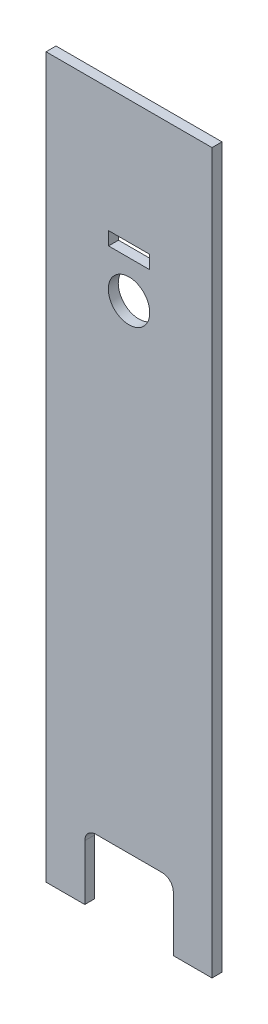
ISO-10303-21;
HEADER;
FILE_DESCRIPTION(('STEP AP214'),'2;1');
FILE_NAME('part.step','',(''),(''),'','','');
FILE_SCHEMA(('AUTOMOTIVE_DESIGN { 1 0 10303 214 1 1 1 1 }'));
ENDSEC;
DATA;
#1=APPLICATION_CONTEXT('core data for automotive mechanical design processes');
#2=APPLICATION_PROTOCOL_DEFINITION('international standard','automotive_design',2000,#1);
#3=PRODUCT_CONTEXT('',#1,'mechanical');
#4=PRODUCT('Part','Part','',(#3));
#5=PRODUCT_RELATED_PRODUCT_CATEGORY('part','',(#4));
#6=PRODUCT_DEFINITION_FORMATION('','',#4);
#7=PRODUCT_DEFINITION_CONTEXT('part definition',#1,'design');
#8=PRODUCT_DEFINITION('design','',#6,#7);
#9=PRODUCT_DEFINITION_SHAPE('','',#8);
#10=(LENGTH_UNIT() NAMED_UNIT(*) SI_UNIT(.MILLI.,.METRE.));
#11=(NAMED_UNIT(*) PLANE_ANGLE_UNIT() SI_UNIT($,.RADIAN.));
#12=(NAMED_UNIT(*) SI_UNIT($,.STERADIAN.) SOLID_ANGLE_UNIT());
#13=UNCERTAINTY_MEASURE_WITH_UNIT(LENGTH_MEASURE(1.E-05),#10,'distance_accuracy_value','');
#14=(GEOMETRIC_REPRESENTATION_CONTEXT(3) GLOBAL_UNCERTAINTY_ASSIGNED_CONTEXT((#13)) GLOBAL_UNIT_ASSIGNED_CONTEXT((#10,
#11,#12)) REPRESENTATION_CONTEXT('',''));
#15=CARTESIAN_POINT('',(0.,0.,0.));
#16=DIRECTION('',(0.,0.,1.));
#17=DIRECTION('',(1.,0.,0.));
#18=AXIS2_PLACEMENT_3D('',#15,#16,#17);
#19=CARTESIAN_POINT('',(-150.,-650.,18.));
#20=DIRECTION('',(0.,1.,0.));
#21=DIRECTION('',(0.,0.,1.));
#22=AXIS2_PLACEMENT_3D('',#19,#20,#21);
#23=PLANE('',#22);
#24=DIRECTION('',(1.,0.,0.));
#25=VECTOR('',#24,1.);
#26=CARTESIAN_POINT('',(-150.,-650.,18.));
#27=LINE('',#26,#25);
#28=CARTESIAN_POINT('',(80.0000000000001,-650.,18.));
#29=VERTEX_POINT('',#28);
#30=CARTESIAN_POINT('',(150.,-650.,18.));
#31=VERTEX_POINT('',#30);
#32=EDGE_CURVE('E239',#29,#31,#27,.T.);
#33=ORIENTED_EDGE('',*,*,#32,.F.);
#34=DIRECTION('',(0.,0.,-1.));
#35=VECTOR('',#34,1.);
#36=CARTESIAN_POINT('',(80.0000000000001,-650.,18.));
#37=LINE('',#36,#35);
#38=CARTESIAN_POINT('',(80.0000000000001,-650.,0.));
#39=VERTEX_POINT('',#38);
#40=EDGE_CURVE('E210',#29,#39,#37,.T.);
#41=ORIENTED_EDGE('',*,*,#40,.T.);
#42=DIRECTION('',(1.,0.,0.));
#43=VECTOR('',#42,1.);
#44=CARTESIAN_POINT('',(-150.,-650.,0.));
#45=LINE('',#44,#43);
#46=CARTESIAN_POINT('',(150.,-650.,0.));
#47=VERTEX_POINT('',#46);
#48=EDGE_CURVE('E251',#39,#47,#45,.T.);
#49=ORIENTED_EDGE('',*,*,#48,.T.);
#50=DIRECTION('',(0.,0.,-1.));
#51=VECTOR('',#50,1.);
#52=CARTESIAN_POINT('',(150.,-650.,18.));
#53=LINE('',#52,#51);
#54=EDGE_CURVE('E58',#31,#47,#53,.T.);
#55=ORIENTED_EDGE('',*,*,#54,.F.);
#56=EDGE_LOOP('',(#33,#41,#49,#55));
#57=FACE_BOUND('',#56,.T.);
#58=ADVANCED_FACE('F50',(#57),#23,.F.);
#59=CARTESIAN_POINT('',(-150.,650.,18.));
#60=DIRECTION('',(1.,0.,0.));
#61=DIRECTION('',(0.,1.,0.));
#62=AXIS2_PLACEMENT_3D('',#59,#60,#61);
#63=PLANE('',#62);
#64=DIRECTION('',(0.,-1.,0.));
#65=VECTOR('',#64,1.);
#66=CARTESIAN_POINT('',(-150.,650.,0.));
#67=LINE('',#66,#65);
#68=CARTESIAN_POINT('',(-150.,650.,0.));
#69=VERTEX_POINT('',#68);
#70=CARTESIAN_POINT('',(-150.,-650.,0.));
#71=VERTEX_POINT('',#70);
#72=EDGE_CURVE('E225',#69,#71,#67,.T.);
#73=ORIENTED_EDGE('',*,*,#72,.T.);
#74=DIRECTION('',(0.,0.,-1.));
#75=VECTOR('',#74,1.);
#76=CARTESIAN_POINT('',(-150.,-650.,18.));
#77=LINE('',#76,#75);
#78=CARTESIAN_POINT('',(-150.,-650.,18.));
#79=VERTEX_POINT('',#78);
#80=EDGE_CURVE('E13',#79,#71,#77,.T.);
#81=ORIENTED_EDGE('',*,*,#80,.F.);
#82=DIRECTION('',(0.,-1.,0.));
#83=VECTOR('',#82,1.);
#84=CARTESIAN_POINT('',(-150.,650.,18.));
#85=LINE('',#84,#83);
#86=CARTESIAN_POINT('',(-150.,650.,18.));
#87=VERTEX_POINT('',#86);
#88=EDGE_CURVE('E236',#87,#79,#85,.T.);
#89=ORIENTED_EDGE('',*,*,#88,.F.);
#90=DIRECTION('',(0.,0.,-1.));
#91=VECTOR('',#90,1.);
#92=CARTESIAN_POINT('',(-150.,650.,18.));
#93=LINE('',#92,#91);
#94=EDGE_CURVE('E248',#87,#69,#93,.T.);
#95=ORIENTED_EDGE('',*,*,#94,.T.);
#96=EDGE_LOOP('',(#73,#81,#89,#95));
#97=FACE_BOUND('',#96,.T.);
#98=ADVANCED_FACE('F52',(#97),#63,.F.);
#99=CARTESIAN_POINT('',(-79.9999999999999,-650.,0.));
#100=VERTEX_POINT('',#99);
#101=EDGE_CURVE('E252',#71,#100,#45,.T.);
#102=ORIENTED_EDGE('',*,*,#101,.T.);
#103=DIRECTION('',(0.,0.,-1.));
#104=VECTOR('',#103,1.);
#105=CARTESIAN_POINT('',(-79.9999999999999,-650.,18.));
#106=LINE('',#105,#104);
#107=CARTESIAN_POINT('',(-79.9999999999999,-650.,18.));
#108=VERTEX_POINT('',#107);
#109=EDGE_CURVE('E232',#108,#100,#106,.T.);
#110=ORIENTED_EDGE('',*,*,#109,.F.);
#111=EDGE_CURVE('E241',#79,#108,#27,.T.);
#112=ORIENTED_EDGE('',*,*,#111,.F.);
#113=ORIENTED_EDGE('',*,*,#80,.T.);
#114=EDGE_LOOP('',(#102,#110,#112,#113));
#115=FACE_BOUND('',#114,.T.);
#116=ADVANCED_FACE('F304',(#115),#23,.F.);
#117=CARTESIAN_POINT('',(150.,650.,18.));
#118=DIRECTION('',(-1.,0.,0.));
#119=DIRECTION('',(0.,-1.,0.));
#120=AXIS2_PLACEMENT_3D('',#117,#118,#119);
#121=PLANE('',#120);
#122=DIRECTION('',(0.,1.,0.));
#123=VECTOR('',#122,1.);
#124=CARTESIAN_POINT('',(150.,650.,0.));
#125=LINE('',#124,#123);
#126=CARTESIAN_POINT('',(150.,650.,0.));
#127=VERTEX_POINT('',#126);
#128=EDGE_CURVE('E255',#47,#127,#125,.T.);
#129=ORIENTED_EDGE('',*,*,#128,.T.);
#130=DIRECTION('',(0.,0.,-1.));
#131=VECTOR('',#130,1.);
#132=CARTESIAN_POINT('',(150.,650.,18.));
#133=LINE('',#132,#131);
#134=CARTESIAN_POINT('',(150.,650.,18.));
#135=VERTEX_POINT('',#134);
#136=EDGE_CURVE('E260',#135,#127,#133,.T.);
#137=ORIENTED_EDGE('',*,*,#136,.F.);
#138=DIRECTION('',(0.,1.,0.));
#139=VECTOR('',#138,1.);
#140=CARTESIAN_POINT('',(150.,650.,18.));
#141=LINE('',#140,#139);
#142=EDGE_CURVE('E244',#31,#135,#141,.T.);
#143=ORIENTED_EDGE('',*,*,#142,.F.);
#144=ORIENTED_EDGE('',*,*,#54,.T.);
#145=EDGE_LOOP('',(#129,#137,#143,#144));
#146=FACE_BOUND('',#145,.T.);
#147=ADVANCED_FACE('F267',(#146),#121,.F.);
#148=CARTESIAN_POINT('',(-150.,650.,18.));
#149=DIRECTION('',(0.,-1.,0.));
#150=DIRECTION('',(0.,0.,-1.));
#151=AXIS2_PLACEMENT_3D('',#148,#149,#150);
#152=PLANE('',#151);
#153=DIRECTION('',(-1.,0.,0.));
#154=VECTOR('',#153,1.);
#155=CARTESIAN_POINT('',(-150.,650.,0.));
#156=LINE('',#155,#154);
#157=EDGE_CURVE('E240',#127,#69,#156,.T.);
#158=ORIENTED_EDGE('',*,*,#157,.T.);
#159=ORIENTED_EDGE('',*,*,#94,.F.);
#160=DIRECTION('',(-1.,0.,0.));
#161=VECTOR('',#160,1.);
#162=CARTESIAN_POINT('',(-150.,650.,18.));
#163=LINE('',#162,#161);
#164=EDGE_CURVE('E246',#135,#87,#163,.T.);
#165=ORIENTED_EDGE('',*,*,#164,.F.);
#166=ORIENTED_EDGE('',*,*,#136,.T.);
#167=EDGE_LOOP('',(#158,#159,#165,#166));
#168=FACE_BOUND('',#167,.T.);
#169=ADVANCED_FACE('F278',(#168),#152,.F.);
#170=CARTESIAN_POINT('',(0.,0.,18.));
#171=DIRECTION('',(0.,0.,1.));
#172=DIRECTION('',(1.,0.,0.));
#173=AXIS2_PLACEMENT_3D('',#170,#171,#172);
#174=PLANE('',#173);
#175=DIRECTION('',(0.,-1.,0.));
#176=VECTOR('',#175,1.);
#177=CARTESIAN_POINT('',(-37.,402.517498316486,18.));
#178=LINE('',#177,#176);
#179=CARTESIAN_POINT('',(-37.,426.517498316486,18.));
#180=VERTEX_POINT('',#179);
#181=CARTESIAN_POINT('',(-37.,402.517498316485,18.));
#182=VERTEX_POINT('',#181);
#183=EDGE_CURVE('E65',#180,#182,#178,.T.);
#184=ORIENTED_EDGE('',*,*,#183,.F.);
#185=DIRECTION('',(-1.,0.,0.));
#186=VECTOR('',#185,1.);
#187=CARTESIAN_POINT('',(-37.,426.517498316486,18.));
#188=LINE('',#187,#186);
#189=CARTESIAN_POINT('',(37.,426.517498316486,18.));
#190=VERTEX_POINT('',#189);
#191=EDGE_CURVE('E169',#190,#180,#188,.T.);
#192=ORIENTED_EDGE('',*,*,#191,.F.);
#193=DIRECTION('',(0.,1.,0.));
#194=VECTOR('',#193,1.);
#195=CARTESIAN_POINT('',(37.,402.482501683514,18.));
#196=LINE('',#195,#194);
#197=CARTESIAN_POINT('',(37.,402.482501683514,18.));
#198=VERTEX_POINT('',#197);
#199=EDGE_CURVE('E172',#198,#190,#196,.T.);
#200=ORIENTED_EDGE('',*,*,#199,.F.);
#201=DIRECTION('',(0.999999888169822,-0.000472927419696015,0.));
#202=VECTOR('',#201,1.);
#203=CARTESIAN_POINT('',(-37.,402.517498316486,18.));
#204=LINE('',#203,#202);
#205=EDGE_CURVE('E178',#182,#198,#204,.T.);
#206=ORIENTED_EDGE('',*,*,#205,.F.);
#207=EDGE_LOOP('',(#184,#192,#200,#206));
#208=FACE_BOUND('',#207,.T.);
#209=CARTESIAN_POINT('',(0.,335.,18.));
#210=DIRECTION('',(0.,0.,-1.));
#211=DIRECTION('',(-1.,0.,0.));
#212=AXIS2_PLACEMENT_3D('',#209,#210,#211);
#213=CIRCLE('',#212,37.5);
#214=CARTESIAN_POINT('',(-37.5,335.,18.));
#215=VERTEX_POINT('',#214);
#216=EDGE_CURVE('E188',#215,#215,#213,.T.);
#217=ORIENTED_EDGE('',*,*,#216,.T.);
#218=EDGE_LOOP('',(#217));
#219=FACE_BOUND('',#218,.T.);
#220=DIRECTION('',(0.,-1.,0.));
#221=VECTOR('',#220,1.);
#222=CARTESIAN_POINT('',(80.0000000000001,-650.,18.));
#223=LINE('',#222,#221);
#224=CARTESIAN_POINT('',(80.0000000000001,-550.,18.));
#225=VERTEX_POINT('',#224);
#226=EDGE_CURVE('E194',#225,#29,#223,.T.);
#227=ORIENTED_EDGE('',*,*,#226,.T.);
#228=ORIENTED_EDGE('',*,*,#32,.T.);
#229=ORIENTED_EDGE('',*,*,#142,.T.);
#230=ORIENTED_EDGE('',*,*,#164,.T.);
#231=ORIENTED_EDGE('',*,*,#88,.T.);
#232=ORIENTED_EDGE('',*,*,#111,.T.);
#233=DIRECTION('',(0.,1.,0.));
#234=VECTOR('',#233,1.);
#235=CARTESIAN_POINT('',(-79.9999999999999,-650.,18.));
#236=LINE('',#235,#234);
#237=CARTESIAN_POINT('',(-79.9999999999999,-550.,18.));
#238=VERTEX_POINT('',#237);
#239=EDGE_CURVE('E197',#108,#238,#236,.T.);
#240=ORIENTED_EDGE('',*,*,#239,.T.);
#241=CARTESIAN_POINT('',(-59.9999999999999,-550.,18.));
#242=DIRECTION('',(0.,0.,-1.));
#243=DIRECTION('',(1.,0.,0.));
#244=AXIS2_PLACEMENT_3D('',#241,#242,#243);
#245=CIRCLE('',#244,20.);
#246=CARTESIAN_POINT('',(-59.9999999999998,-530.,18.));
#247=VERTEX_POINT('',#246);
#248=EDGE_CURVE('E201',#238,#247,#245,.T.);
#249=ORIENTED_EDGE('',*,*,#248,.T.);
#250=DIRECTION('',(1.,0.,0.));
#251=VECTOR('',#250,1.);
#252=CARTESIAN_POINT('',(59.9999999999999,-530.,18.));
#253=LINE('',#252,#251);
#254=CARTESIAN_POINT('',(59.9999999999999,-530.,18.));
#255=VERTEX_POINT('',#254);
#256=EDGE_CURVE('E204',#247,#255,#253,.T.);
#257=ORIENTED_EDGE('',*,*,#256,.T.);
#258=CARTESIAN_POINT('',(60.0000000000001,-550.,18.));
#259=DIRECTION('',(0.,0.,-1.));
#260=DIRECTION('',(-1.,0.,0.));
#261=AXIS2_PLACEMENT_3D('',#258,#259,#260);
#262=CIRCLE('',#261,20.);
#263=EDGE_CURVE('E207',#255,#225,#262,.T.);
#264=ORIENTED_EDGE('',*,*,#263,.T.);
#265=EDGE_LOOP('',(#227,#228,#229,#230,#231,#232,#240,#249,#257,#264));
#266=FACE_BOUND('',#265,.T.);
#267=ADVANCED_FACE('F284',(#208,#219,#266),#174,.T.);
#268=CARTESIAN_POINT('',(0.,0.,0.));
#269=DIRECTION('',(0.,0.,1.));
#270=DIRECTION('',(1.,0.,0.));
#271=AXIS2_PLACEMENT_3D('',#268,#269,#270);
#272=PLANE('',#271);
#273=DIRECTION('',(-1.,0.,0.));
#274=VECTOR('',#273,1.);
#275=CARTESIAN_POINT('',(-37.,426.517498316486,0.));
#276=LINE('',#275,#274);
#277=CARTESIAN_POINT('',(37.,426.517498316486,0.));
#278=VERTEX_POINT('',#277);
#279=CARTESIAN_POINT('',(-37.,426.517498316486,0.));
#280=VERTEX_POINT('',#279);
#281=EDGE_CURVE('E159',#278,#280,#276,.T.);
#282=ORIENTED_EDGE('',*,*,#281,.T.);
#283=DIRECTION('',(0.,-1.,0.));
#284=VECTOR('',#283,1.);
#285=CARTESIAN_POINT('',(-37.,402.517498316486,0.));
#286=LINE('',#285,#284);
#287=CARTESIAN_POINT('',(-37.,402.517498316486,0.));
#288=VERTEX_POINT('',#287);
#289=EDGE_CURVE('E153',#280,#288,#286,.T.);
#290=ORIENTED_EDGE('',*,*,#289,.T.);
#291=DIRECTION('',(0.999999888169822,-0.000472927419696015,0.));
#292=VECTOR('',#291,1.);
#293=CARTESIAN_POINT('',(-37.,402.517498316486,0.));
#294=LINE('',#293,#292);
#295=CARTESIAN_POINT('',(37.,402.482501683514,0.));
#296=VERTEX_POINT('',#295);
#297=EDGE_CURVE('E162',#288,#296,#294,.T.);
#298=ORIENTED_EDGE('',*,*,#297,.T.);
#299=DIRECTION('',(0.,1.,0.));
#300=VECTOR('',#299,1.);
#301=CARTESIAN_POINT('',(37.,402.482501683514,0.));
#302=LINE('',#301,#300);
#303=EDGE_CURVE('E73',#296,#278,#302,.T.);
#304=ORIENTED_EDGE('',*,*,#303,.T.);
#305=EDGE_LOOP('',(#282,#290,#298,#304));
#306=FACE_BOUND('',#305,.T.);
#307=CARTESIAN_POINT('',(0.,335.,0.));
#308=DIRECTION('',(0.,0.,-1.));
#309=DIRECTION('',(-1.,0.,0.));
#310=AXIS2_PLACEMENT_3D('',#307,#308,#309);
#311=CIRCLE('',#310,37.5);
#312=CARTESIAN_POINT('',(-37.5,335.,0.));
#313=VERTEX_POINT('',#312);
#314=EDGE_CURVE('E184',#313,#313,#311,.T.);
#315=ORIENTED_EDGE('',*,*,#314,.F.);
#316=EDGE_LOOP('',(#315));
#317=FACE_BOUND('',#316,.T.);
#318=ORIENTED_EDGE('',*,*,#48,.F.);
#319=DIRECTION('',(0.,-1.,0.));
#320=VECTOR('',#319,1.);
#321=CARTESIAN_POINT('',(80.0000000000001,-650.,0.));
#322=LINE('',#321,#320);
#323=CARTESIAN_POINT('',(80.0000000000001,-550.,0.));
#324=VERTEX_POINT('',#323);
#325=EDGE_CURVE('E191',#324,#39,#322,.T.);
#326=ORIENTED_EDGE('',*,*,#325,.F.);
#327=CARTESIAN_POINT('',(60.0000000000001,-550.,0.));
#328=DIRECTION('',(0.,0.,-1.));
#329=DIRECTION('',(-1.,0.,0.));
#330=AXIS2_PLACEMENT_3D('',#327,#328,#329);
#331=CIRCLE('',#330,20.);
#332=CARTESIAN_POINT('',(59.9999999999999,-530.,0.));
#333=VERTEX_POINT('',#332);
#334=EDGE_CURVE('E198',#333,#324,#331,.T.);
#335=ORIENTED_EDGE('',*,*,#334,.F.);
#336=DIRECTION('',(1.,0.,0.));
#337=VECTOR('',#336,1.);
#338=CARTESIAN_POINT('',(59.9999999999999,-530.,0.));
#339=LINE('',#338,#337);
#340=CARTESIAN_POINT('',(-59.9999999999998,-530.,0.));
#341=VERTEX_POINT('',#340);
#342=EDGE_CURVE('E218',#341,#333,#339,.T.);
#343=ORIENTED_EDGE('',*,*,#342,.F.);
#344=CARTESIAN_POINT('',(-59.9999999999999,-550.,0.));
#345=DIRECTION('',(0.,0.,-1.));
#346=DIRECTION('',(1.,0.,0.));
#347=AXIS2_PLACEMENT_3D('',#344,#345,#346);
#348=CIRCLE('',#347,20.);
#349=CARTESIAN_POINT('',(-79.9999999999999,-550.,0.));
#350=VERTEX_POINT('',#349);
#351=EDGE_CURVE('E215',#350,#341,#348,.T.);
#352=ORIENTED_EDGE('',*,*,#351,.F.);
#353=DIRECTION('',(0.,1.,0.));
#354=VECTOR('',#353,1.);
#355=CARTESIAN_POINT('',(-79.9999999999999,-650.,0.));
#356=LINE('',#355,#354);
#357=EDGE_CURVE('E212',#100,#350,#356,.T.);
#358=ORIENTED_EDGE('',*,*,#357,.F.);
#359=ORIENTED_EDGE('',*,*,#101,.F.);
#360=ORIENTED_EDGE('',*,*,#72,.F.);
#361=ORIENTED_EDGE('',*,*,#157,.F.);
#362=ORIENTED_EDGE('',*,*,#128,.F.);
#363=EDGE_LOOP('',(#318,#326,#335,#343,#352,#358,#359,#360,#361,#362));
#364=FACE_BOUND('',#363,.T.);
#365=ADVANCED_FACE('F166',(#306,#317,#364),#272,.F.);
#366=CARTESIAN_POINT('',(80.0000000000001,-650.,18.));
#367=DIRECTION('',(1.,0.,0.));
#368=DIRECTION('',(0.,0.,-1.));
#369=AXIS2_PLACEMENT_3D('',#366,#367,#368);
#370=PLANE('',#369);
#371=ORIENTED_EDGE('',*,*,#325,.T.);
#372=ORIENTED_EDGE('',*,*,#40,.F.);
#373=ORIENTED_EDGE('',*,*,#226,.F.);
#374=DIRECTION('',(0.,0.,-1.));
#375=VECTOR('',#374,1.);
#376=CARTESIAN_POINT('',(80.0000000000001,-550.,18.));
#377=LINE('',#376,#375);
#378=EDGE_CURVE('E223',#225,#324,#377,.T.);
#379=ORIENTED_EDGE('',*,*,#378,.T.);
#380=EDGE_LOOP('',(#371,#372,#373,#379));
#381=FACE_BOUND('',#380,.T.);
#382=ADVANCED_FACE('F287',(#381),#370,.F.);
#383=CARTESIAN_POINT('',(60.0000000000001,-550.,18.));
#384=DIRECTION('',(0.,0.,-1.));
#385=DIRECTION('',(-1.,0.,0.));
#386=AXIS2_PLACEMENT_3D('',#383,#384,#385);
#387=CYLINDRICAL_SURFACE('',#386,20.);
#388=ORIENTED_EDGE('',*,*,#334,.T.);
#389=ORIENTED_EDGE('',*,*,#378,.F.);
#390=ORIENTED_EDGE('',*,*,#263,.F.);
#391=DIRECTION('',(0.,0.,-1.));
#392=VECTOR('',#391,1.);
#393=CARTESIAN_POINT('',(59.9999999999999,-530.,18.));
#394=LINE('',#393,#392);
#395=EDGE_CURVE('E226',#255,#333,#394,.T.);
#396=ORIENTED_EDGE('',*,*,#395,.T.);
#397=EDGE_LOOP('',(#388,#389,#390,#396));
#398=FACE_BOUND('',#397,.T.);
#399=ADVANCED_FACE('F292',(#398),#387,.F.);
#400=CARTESIAN_POINT('',(59.9999999999999,-530.,18.));
#401=DIRECTION('',(0.,1.,0.));
#402=DIRECTION('',(0.,0.,1.));
#403=AXIS2_PLACEMENT_3D('',#400,#401,#402);
#404=PLANE('',#403);
#405=ORIENTED_EDGE('',*,*,#342,.T.);
#406=ORIENTED_EDGE('',*,*,#395,.F.);
#407=ORIENTED_EDGE('',*,*,#256,.F.);
#408=DIRECTION('',(0.,0.,-1.));
#409=VECTOR('',#408,1.);
#410=CARTESIAN_POINT('',(-59.9999999999998,-530.,18.));
#411=LINE('',#410,#409);
#412=EDGE_CURVE('E228',#247,#341,#411,.T.);
#413=ORIENTED_EDGE('',*,*,#412,.T.);
#414=EDGE_LOOP('',(#405,#406,#407,#413));
#415=FACE_BOUND('',#414,.T.);
#416=ADVANCED_FACE('F296',(#415),#404,.F.);
#417=CARTESIAN_POINT('',(-59.9999999999999,-550.,18.));
#418=DIRECTION('',(0.,0.,-1.));
#419=DIRECTION('',(-1.,0.,0.));
#420=AXIS2_PLACEMENT_3D('',#417,#418,#419);
#421=CYLINDRICAL_SURFACE('',#420,20.);
#422=ORIENTED_EDGE('',*,*,#351,.T.);
#423=ORIENTED_EDGE('',*,*,#412,.F.);
#424=ORIENTED_EDGE('',*,*,#248,.F.);
#425=DIRECTION('',(0.,0.,-1.));
#426=VECTOR('',#425,1.);
#427=CARTESIAN_POINT('',(-79.9999999999999,-550.,18.));
#428=LINE('',#427,#426);
#429=EDGE_CURVE('E230',#238,#350,#428,.T.);
#430=ORIENTED_EDGE('',*,*,#429,.T.);
#431=EDGE_LOOP('',(#422,#423,#424,#430));
#432=FACE_BOUND('',#431,.T.);
#433=ADVANCED_FACE('F299',(#432),#421,.F.);
#434=CARTESIAN_POINT('',(-79.9999999999999,-650.,18.));
#435=DIRECTION('',(-1.,0.,0.));
#436=DIRECTION('',(0.,0.,1.));
#437=AXIS2_PLACEMENT_3D('',#434,#435,#436);
#438=PLANE('',#437);
#439=ORIENTED_EDGE('',*,*,#357,.T.);
#440=ORIENTED_EDGE('',*,*,#429,.F.);
#441=ORIENTED_EDGE('',*,*,#239,.F.);
#442=ORIENTED_EDGE('',*,*,#109,.T.);
#443=EDGE_LOOP('',(#439,#440,#441,#442));
#444=FACE_BOUND('',#443,.T.);
#445=ADVANCED_FACE('F305',(#444),#438,.F.);
#446=CARTESIAN_POINT('',(0.,335.,18.));
#447=DIRECTION('',(0.,0.,-1.));
#448=DIRECTION('',(-1.,0.,0.));
#449=AXIS2_PLACEMENT_3D('',#446,#447,#448);
#450=CYLINDRICAL_SURFACE('',#449,37.5);
#451=ORIENTED_EDGE('',*,*,#216,.F.);
#452=EDGE_LOOP('',(#451));
#453=FACE_BOUND('',#452,.T.);
#454=ORIENTED_EDGE('',*,*,#314,.T.);
#455=EDGE_LOOP('',(#454));
#456=FACE_BOUND('',#455,.T.);
#457=ADVANCED_FACE('F307',(#453,#456),#450,.F.);
#458=CARTESIAN_POINT('',(-37.,402.517498316486,0.));
#459=DIRECTION('',(-1.,0.,0.));
#460=DIRECTION('',(0.,0.,1.));
#461=AXIS2_PLACEMENT_3D('',#458,#459,#460);
#462=PLANE('',#461);
#463=ORIENTED_EDGE('',*,*,#183,.T.);
#464=DIRECTION('',(0.,0.,1.));
#465=VECTOR('',#464,1.);
#466=CARTESIAN_POINT('',(-37.,402.517498316486,0.));
#467=LINE('',#466,#465);
#468=EDGE_CURVE('E149',#288,#182,#467,.T.);
#469=ORIENTED_EDGE('',*,*,#468,.F.);
#470=ORIENTED_EDGE('',*,*,#289,.F.);
#471=DIRECTION('',(0.,0.,1.));
#472=VECTOR('',#471,1.);
#473=CARTESIAN_POINT('',(-37.,426.517498316486,0.));
#474=LINE('',#473,#472);
#475=EDGE_CURVE('E182',#280,#180,#474,.T.);
#476=ORIENTED_EDGE('',*,*,#475,.T.);
#477=EDGE_LOOP('',(#463,#469,#470,#476));
#478=FACE_BOUND('',#477,.T.);
#479=ADVANCED_FACE('F151',(#478),#462,.F.);
#480=CARTESIAN_POINT('',(-37.,426.517498316486,0.));
#481=DIRECTION('',(0.,1.,0.));
#482=DIRECTION('',(0.,0.,1.));
#483=AXIS2_PLACEMENT_3D('',#480,#481,#482);
#484=PLANE('',#483);
#485=ORIENTED_EDGE('',*,*,#191,.T.);
#486=ORIENTED_EDGE('',*,*,#475,.F.);
#487=ORIENTED_EDGE('',*,*,#281,.F.);
#488=DIRECTION('',(0.,0.,1.));
#489=VECTOR('',#488,1.);
#490=CARTESIAN_POINT('',(37.,426.517498316486,0.));
#491=LINE('',#490,#489);
#492=EDGE_CURVE('E185',#278,#190,#491,.T.);
#493=ORIENTED_EDGE('',*,*,#492,.T.);
#494=EDGE_LOOP('',(#485,#486,#487,#493));
#495=FACE_BOUND('',#494,.T.);
#496=ADVANCED_FACE('F347',(#495),#484,.F.);
#497=CARTESIAN_POINT('',(37.,402.482501683514,0.));
#498=DIRECTION('',(1.,0.,0.));
#499=DIRECTION('',(0.,0.,-1.));
#500=AXIS2_PLACEMENT_3D('',#497,#498,#499);
#501=PLANE('',#500);
#502=ORIENTED_EDGE('',*,*,#199,.T.);
#503=ORIENTED_EDGE('',*,*,#492,.F.);
#504=ORIENTED_EDGE('',*,*,#303,.F.);
#505=DIRECTION('',(0.,0.,1.));
#506=VECTOR('',#505,1.);
#507=CARTESIAN_POINT('',(37.,402.482501683514,0.));
#508=LINE('',#507,#506);
#509=EDGE_CURVE('E158',#296,#198,#508,.T.);
#510=ORIENTED_EDGE('',*,*,#509,.T.);
#511=EDGE_LOOP('',(#502,#503,#504,#510));
#512=FACE_BOUND('',#511,.T.);
#513=ADVANCED_FACE('F350',(#512),#501,.F.);
#514=CARTESIAN_POINT('',(-37.,402.517498316486,0.));
#515=DIRECTION('',(-0.000472927419696015,-0.999999888169822,0.));
#516=DIRECTION('',(0.999999888169822,-0.000472927419696015,0.));
#517=AXIS2_PLACEMENT_3D('',#514,#515,#516);
#518=PLANE('',#517);
#519=ORIENTED_EDGE('',*,*,#205,.T.);
#520=ORIENTED_EDGE('',*,*,#509,.F.);
#521=ORIENTED_EDGE('',*,*,#297,.F.);
#522=ORIENTED_EDGE('',*,*,#468,.T.);
#523=EDGE_LOOP('',(#519,#520,#521,#522));
#524=FACE_BOUND('',#523,.T.);
#525=ADVANCED_FACE('F163',(#524),#518,.F.);
#526=CLOSED_SHELL('',(#58,#98,#116,#147,#169,#267,#365,#382,#399,#416,#433,#445,#457,#479,#496,
#513,#525));
#527=MANIFOLD_SOLID_BREP('B2',#526);
#528=ADVANCED_BREP_SHAPE_REPRESENTATION('',(#18,#527),#14);
#529=SHAPE_DEFINITION_REPRESENTATION(#9,#528);
ENDSEC;
END-ISO-10303-21;
